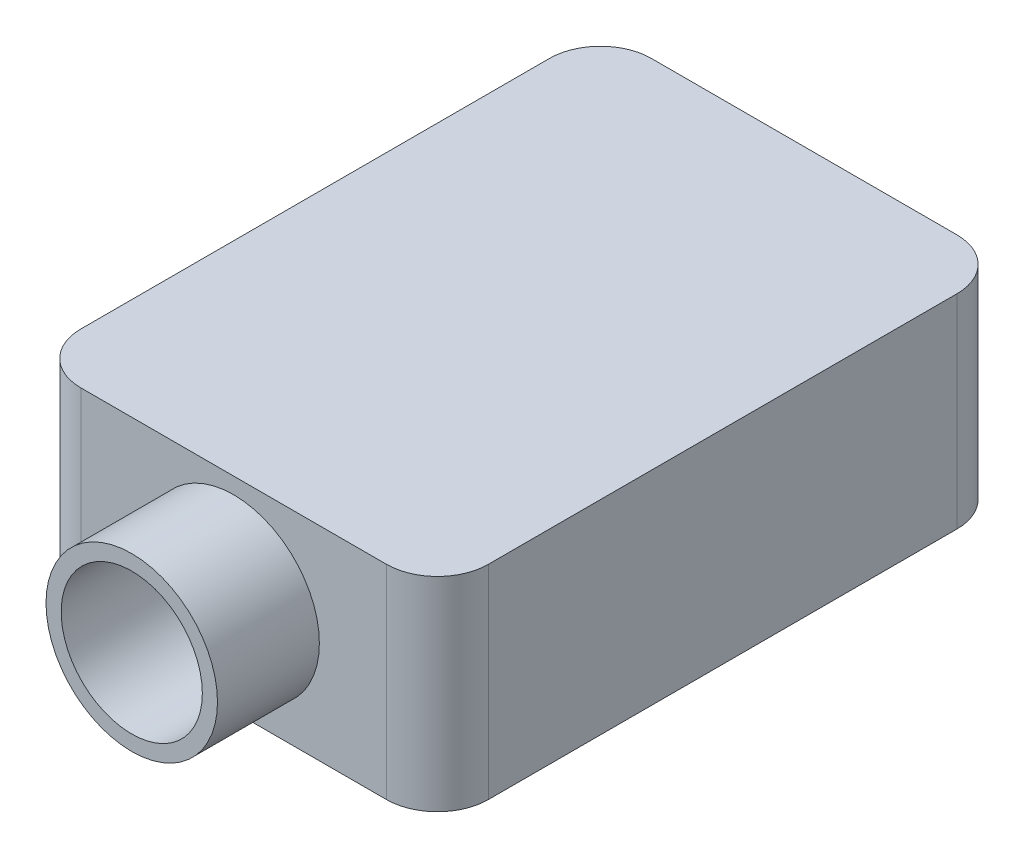
ISO-10303-21;
HEADER;
FILE_DESCRIPTION(('STEP AP214'),'2;1');
FILE_NAME('part.step','',(''),(''),'','','');
FILE_SCHEMA(('AUTOMOTIVE_DESIGN { 1 0 10303 214 1 1 1 1 }'));
ENDSEC;
DATA;
#1=APPLICATION_CONTEXT('core data for automotive mechanical design processes');
#2=APPLICATION_PROTOCOL_DEFINITION('international standard','automotive_design',2000,#1);
#3=PRODUCT_CONTEXT('',#1,'mechanical');
#4=PRODUCT('Part','Part','',(#3));
#5=PRODUCT_RELATED_PRODUCT_CATEGORY('part','',(#4));
#6=PRODUCT_DEFINITION_FORMATION('','',#4);
#7=PRODUCT_DEFINITION_CONTEXT('part definition',#1,'design');
#8=PRODUCT_DEFINITION('design','',#6,#7);
#9=PRODUCT_DEFINITION_SHAPE('','',#8);
#10=(LENGTH_UNIT() NAMED_UNIT(*) SI_UNIT(.MILLI.,.METRE.));
#11=(NAMED_UNIT(*) PLANE_ANGLE_UNIT() SI_UNIT($,.RADIAN.));
#12=(NAMED_UNIT(*) SI_UNIT($,.STERADIAN.) SOLID_ANGLE_UNIT());
#13=UNCERTAINTY_MEASURE_WITH_UNIT(LENGTH_MEASURE(1.E-05),#10,'distance_accuracy_value','');
#14=(GEOMETRIC_REPRESENTATION_CONTEXT(3) GLOBAL_UNCERTAINTY_ASSIGNED_CONTEXT((#13)) GLOBAL_UNIT_ASSIGNED_CONTEXT((#10,
#11,#12)) REPRESENTATION_CONTEXT('',''));
#15=CARTESIAN_POINT('',(0.,0.,0.));
#16=DIRECTION('',(0.,0.,1.));
#17=DIRECTION('',(1.,0.,0.));
#18=AXIS2_PLACEMENT_3D('',#15,#16,#17);
#19=CARTESIAN_POINT('',(20.,20.,28.));
#20=DIRECTION('',(-1.,0.,0.));
#21=DIRECTION('',(0.,0.,1.));
#22=AXIS2_PLACEMENT_3D('',#19,#20,#21);
#23=PLANE('',#22);
#24=DIRECTION('',(0.,0.,-1.));
#25=VECTOR('',#24,1.);
#26=CARTESIAN_POINT('',(20.,0.,28.));
#27=LINE('',#26,#25);
#28=CARTESIAN_POINT('',(20.,0.,23.));
#29=VERTEX_POINT('',#28);
#30=CARTESIAN_POINT('',(20.,0.,-23.));
#31=VERTEX_POINT('',#30);
#32=EDGE_CURVE('E130',#29,#31,#27,.T.);
#33=ORIENTED_EDGE('',*,*,#32,.T.);
#34=DIRECTION('',(0.,-1.,0.));
#35=VECTOR('',#34,1.);
#36=CARTESIAN_POINT('',(20.,20.,-23.));
#37=LINE('',#36,#35);
#38=CARTESIAN_POINT('',(20.,20.,-23.));
#39=VERTEX_POINT('',#38);
#40=EDGE_CURVE('E11',#31,#39,#37,.F.);
#41=ORIENTED_EDGE('',*,*,#40,.T.);
#42=DIRECTION('',(0.,0.,-1.));
#43=VECTOR('',#42,1.);
#44=CARTESIAN_POINT('',(20.,20.,28.));
#45=LINE('',#44,#43);
#46=CARTESIAN_POINT('',(20.,20.,23.));
#47=VERTEX_POINT('',#46);
#48=EDGE_CURVE('E128',#47,#39,#45,.T.);
#49=ORIENTED_EDGE('',*,*,#48,.F.);
#50=DIRECTION('',(0.,-1.,0.));
#51=VECTOR('',#50,1.);
#52=CARTESIAN_POINT('',(20.,20.,23.));
#53=LINE('',#52,#51);
#54=EDGE_CURVE('E42',#47,#29,#53,.T.);
#55=ORIENTED_EDGE('',*,*,#54,.T.);
#56=EDGE_LOOP('',(#33,#41,#49,#55));
#57=FACE_BOUND('',#56,.T.);
#58=ADVANCED_FACE('F34',(#57),#23,.F.);
#59=CARTESIAN_POINT('',(-20.,20.,-28.));
#60=DIRECTION('',(0.,0.,1.));
#61=DIRECTION('',(1.,0.,0.));
#62=AXIS2_PLACEMENT_3D('',#59,#60,#61);
#63=PLANE('',#62);
#64=DIRECTION('',(-1.,0.,0.));
#65=VECTOR('',#64,1.);
#66=CARTESIAN_POINT('',(-20.,0.,-28.));
#67=LINE('',#66,#65);
#68=CARTESIAN_POINT('',(15.,0.,-28.));
#69=VERTEX_POINT('',#68);
#70=CARTESIAN_POINT('',(-15.,0.,-28.));
#71=VERTEX_POINT('',#70);
#72=EDGE_CURVE('E126',#69,#71,#67,.T.);
#73=ORIENTED_EDGE('',*,*,#72,.T.);
#74=DIRECTION('',(0.,-1.,0.));
#75=VECTOR('',#74,1.);
#76=CARTESIAN_POINT('',(-15.,20.,-28.));
#77=LINE('',#76,#75);
#78=CARTESIAN_POINT('',(-15.,20.,-28.));
#79=VERTEX_POINT('',#78);
#80=EDGE_CURVE('E105',#71,#79,#77,.F.);
#81=ORIENTED_EDGE('',*,*,#80,.T.);
#82=DIRECTION('',(-1.,0.,0.));
#83=VECTOR('',#82,1.);
#84=CARTESIAN_POINT('',(-20.,20.,-28.));
#85=LINE('',#84,#83);
#86=CARTESIAN_POINT('',(15.,20.,-28.));
#87=VERTEX_POINT('',#86);
#88=EDGE_CURVE('E173',#87,#79,#85,.T.);
#89=ORIENTED_EDGE('',*,*,#88,.F.);
#90=DIRECTION('',(0.,-1.,0.));
#91=VECTOR('',#90,1.);
#92=CARTESIAN_POINT('',(15.,20.,-28.));
#93=LINE('',#92,#91);
#94=EDGE_CURVE('E110',#87,#69,#93,.T.);
#95=ORIENTED_EDGE('',*,*,#94,.T.);
#96=EDGE_LOOP('',(#73,#81,#89,#95));
#97=FACE_BOUND('',#96,.T.);
#98=ADVANCED_FACE('F201',(#97),#63,.F.);
#99=CARTESIAN_POINT('',(-20.,20.,28.));
#100=DIRECTION('',(1.,0.,0.));
#101=DIRECTION('',(0.,0.,-1.));
#102=AXIS2_PLACEMENT_3D('',#99,#100,#101);
#103=PLANE('',#102);
#104=DIRECTION('',(0.,0.,1.));
#105=VECTOR('',#104,1.);
#106=CARTESIAN_POINT('',(-20.,20.,28.));
#107=LINE('',#106,#105);
#108=CARTESIAN_POINT('',(-20.,20.,-23.));
#109=VERTEX_POINT('',#108);
#110=CARTESIAN_POINT('',(-20.,20.,23.));
#111=VERTEX_POINT('',#110);
#112=EDGE_CURVE('E119',#109,#111,#107,.T.);
#113=ORIENTED_EDGE('',*,*,#112,.F.);
#114=DIRECTION('',(0.,-1.,0.));
#115=VECTOR('',#114,1.);
#116=CARTESIAN_POINT('',(-20.,20.,-23.));
#117=LINE('',#116,#115);
#118=CARTESIAN_POINT('',(-20.,0.,-23.));
#119=VERTEX_POINT('',#118);
#120=EDGE_CURVE('E104',#109,#119,#117,.T.);
#121=ORIENTED_EDGE('',*,*,#120,.T.);
#122=DIRECTION('',(0.,0.,1.));
#123=VECTOR('',#122,1.);
#124=CARTESIAN_POINT('',(-20.,0.,28.));
#125=LINE('',#124,#123);
#126=CARTESIAN_POINT('',(-20.,0.,23.));
#127=VERTEX_POINT('',#126);
#128=EDGE_CURVE('E117',#119,#127,#125,.T.);
#129=ORIENTED_EDGE('',*,*,#128,.T.);
#130=DIRECTION('',(0.,-1.,0.));
#131=VECTOR('',#130,1.);
#132=CARTESIAN_POINT('',(-20.,20.,23.));
#133=LINE('',#132,#131);
#134=EDGE_CURVE('E121',#127,#111,#133,.F.);
#135=ORIENTED_EDGE('',*,*,#134,.T.);
#136=EDGE_LOOP('',(#113,#121,#129,#135));
#137=FACE_BOUND('',#136,.T.);
#138=ADVANCED_FACE('F116',(#137),#103,.F.);
#139=CARTESIAN_POINT('',(-20.,20.,28.));
#140=DIRECTION('',(0.,0.,-1.));
#141=DIRECTION('',(-1.,0.,0.));
#142=AXIS2_PLACEMENT_3D('',#139,#140,#141);
#143=PLANE('',#142);
#144=CARTESIAN_POINT('',(0.,10.,28.));
#145=DIRECTION('',(0.,0.,-1.));
#146=DIRECTION('',(-1.,0.,0.));
#147=AXIS2_PLACEMENT_3D('',#144,#145,#146);
#148=CIRCLE('',#147,8.41555302950392);
#149=CARTESIAN_POINT('',(-8.41555302950392,10.,28.));
#150=VERTEX_POINT('',#149);
#151=EDGE_CURVE('E134',#150,#150,#148,.F.);
#152=ORIENTED_EDGE('',*,*,#151,.F.);
#153=EDGE_LOOP('',(#152));
#154=FACE_BOUND('',#153,.T.);
#155=DIRECTION('',(1.,0.,0.));
#156=VECTOR('',#155,1.);
#157=CARTESIAN_POINT('',(-20.,20.,28.));
#158=LINE('',#157,#156);
#159=CARTESIAN_POINT('',(-15.,20.,28.));
#160=VERTEX_POINT('',#159);
#161=CARTESIAN_POINT('',(15.,20.,28.));
#162=VERTEX_POINT('',#161);
#163=EDGE_CURVE('E137',#160,#162,#158,.T.);
#164=ORIENTED_EDGE('',*,*,#163,.F.);
#165=DIRECTION('',(0.,-1.,0.));
#166=VECTOR('',#165,1.);
#167=CARTESIAN_POINT('',(-15.,20.,28.));
#168=LINE('',#167,#166);
#169=CARTESIAN_POINT('',(-15.,0.,28.));
#170=VERTEX_POINT('',#169);
#171=EDGE_CURVE('E154',#160,#170,#168,.T.);
#172=ORIENTED_EDGE('',*,*,#171,.T.);
#173=DIRECTION('',(1.,0.,0.));
#174=VECTOR('',#173,1.);
#175=CARTESIAN_POINT('',(-20.,0.,28.));
#176=LINE('',#175,#174);
#177=CARTESIAN_POINT('',(15.,0.,28.));
#178=VERTEX_POINT('',#177);
#179=EDGE_CURVE('E125',#170,#178,#176,.T.);
#180=ORIENTED_EDGE('',*,*,#179,.T.);
#181=DIRECTION('',(0.,-1.,0.));
#182=VECTOR('',#181,1.);
#183=CARTESIAN_POINT('',(15.,20.,28.));
#184=LINE('',#183,#182);
#185=EDGE_CURVE('E49',#178,#162,#184,.F.);
#186=ORIENTED_EDGE('',*,*,#185,.T.);
#187=EDGE_LOOP('',(#164,#172,#180,#186));
#188=FACE_BOUND('',#187,.T.);
#189=ADVANCED_FACE('F226',(#154,#188),#143,.F.);
#190=CARTESIAN_POINT('',(0.,20.,0.));
#191=DIRECTION('',(0.,-1.,0.));
#192=DIRECTION('',(0.,0.,-1.));
#193=AXIS2_PLACEMENT_3D('',#190,#191,#192);
#194=PLANE('',#193);
#195=ORIENTED_EDGE('',*,*,#88,.T.);
#196=CARTESIAN_POINT('',(-15.,20.,-23.));
#197=DIRECTION('',(0.,-1.,0.));
#198=DIRECTION('',(0.,0.,-1.));
#199=AXIS2_PLACEMENT_3D('',#196,#197,#198);
#200=CIRCLE('',#199,5.);
#201=EDGE_CURVE('E151',#79,#109,#200,.F.);
#202=ORIENTED_EDGE('',*,*,#201,.T.);
#203=ORIENTED_EDGE('',*,*,#112,.T.);
#204=CARTESIAN_POINT('',(-15.,20.,23.));
#205=DIRECTION('',(0.,-1.,0.));
#206=DIRECTION('',(0.,0.,-1.));
#207=AXIS2_PLACEMENT_3D('',#204,#205,#206);
#208=CIRCLE('',#207,5.);
#209=EDGE_CURVE('E56',#111,#160,#208,.F.);
#210=ORIENTED_EDGE('',*,*,#209,.T.);
#211=ORIENTED_EDGE('',*,*,#163,.T.);
#212=CARTESIAN_POINT('',(15.,20.,23.));
#213=DIRECTION('',(0.,-1.,0.));
#214=DIRECTION('',(0.,0.,-1.));
#215=AXIS2_PLACEMENT_3D('',#212,#213,#214);
#216=CIRCLE('',#215,5.);
#217=EDGE_CURVE('E146',#162,#47,#216,.F.);
#218=ORIENTED_EDGE('',*,*,#217,.T.);
#219=ORIENTED_EDGE('',*,*,#48,.T.);
#220=CARTESIAN_POINT('',(15.,20.,-23.));
#221=DIRECTION('',(0.,-1.,0.));
#222=DIRECTION('',(0.,0.,-1.));
#223=AXIS2_PLACEMENT_3D('',#220,#221,#222);
#224=CIRCLE('',#223,5.);
#225=EDGE_CURVE('E148',#39,#87,#224,.F.);
#226=ORIENTED_EDGE('',*,*,#225,.T.);
#227=EDGE_LOOP('',(#195,#202,#203,#210,#211,#218,#219,#226));
#228=FACE_BOUND('',#227,.T.);
#229=ADVANCED_FACE('F197',(#228),#194,.F.);
#230=CARTESIAN_POINT('',(0.,0.,0.));
#231=DIRECTION('',(0.,-1.,0.));
#232=DIRECTION('',(0.,0.,-1.));
#233=AXIS2_PLACEMENT_3D('',#230,#231,#232);
#234=PLANE('',#233);
#235=ORIENTED_EDGE('',*,*,#128,.F.);
#236=CARTESIAN_POINT('',(-15.,0.,-23.));
#237=DIRECTION('',(0.,-1.,0.));
#238=DIRECTION('',(0.,0.,-1.));
#239=AXIS2_PLACEMENT_3D('',#236,#237,#238);
#240=CIRCLE('',#239,5.);
#241=EDGE_CURVE('E100',#119,#71,#240,.T.);
#242=ORIENTED_EDGE('',*,*,#241,.T.);
#243=ORIENTED_EDGE('',*,*,#72,.F.);
#244=CARTESIAN_POINT('',(15.,0.,-23.));
#245=DIRECTION('',(0.,-1.,0.));
#246=DIRECTION('',(0.,0.,-1.));
#247=AXIS2_PLACEMENT_3D('',#244,#245,#246);
#248=CIRCLE('',#247,5.);
#249=EDGE_CURVE('E140',#69,#31,#248,.T.);
#250=ORIENTED_EDGE('',*,*,#249,.T.);
#251=ORIENTED_EDGE('',*,*,#32,.F.);
#252=CARTESIAN_POINT('',(15.,0.,23.));
#253=DIRECTION('',(0.,-1.,0.));
#254=DIRECTION('',(0.,0.,-1.));
#255=AXIS2_PLACEMENT_3D('',#252,#253,#254);
#256=CIRCLE('',#255,5.);
#257=EDGE_CURVE('E120',#29,#178,#256,.T.);
#258=ORIENTED_EDGE('',*,*,#257,.T.);
#259=ORIENTED_EDGE('',*,*,#179,.F.);
#260=CARTESIAN_POINT('',(-15.,0.,23.));
#261=DIRECTION('',(0.,-1.,0.));
#262=DIRECTION('',(0.,0.,-1.));
#263=AXIS2_PLACEMENT_3D('',#260,#261,#262);
#264=CIRCLE('',#263,5.);
#265=EDGE_CURVE('E111',#170,#127,#264,.T.);
#266=ORIENTED_EDGE('',*,*,#265,.T.);
#267=EDGE_LOOP('',(#235,#242,#243,#250,#251,#258,#259,#266));
#268=FACE_BOUND('',#267,.T.);
#269=ADVANCED_FACE('F123',(#268),#234,.T.);
#270=CARTESIAN_POINT('',(0.,10.,38.));
#271=DIRECTION('',(0.,0.,1.));
#272=DIRECTION('',(1.,0.,0.));
#273=AXIS2_PLACEMENT_3D('',#270,#271,#272);
#274=PLANE('',#273);
#275=CARTESIAN_POINT('',(0.,10.,38.));
#276=DIRECTION('',(0.,0.,1.));
#277=DIRECTION('',(1.,0.,0.));
#278=AXIS2_PLACEMENT_3D('',#275,#276,#277);
#279=CIRCLE('',#278,8.41555302950392);
#280=CARTESIAN_POINT('',(8.41555302950392,10.,38.));
#281=VERTEX_POINT('',#280);
#282=EDGE_CURVE('E166',#281,#281,#279,.T.);
#283=ORIENTED_EDGE('',*,*,#282,.T.);
#284=EDGE_LOOP('',(#283));
#285=FACE_BOUND('',#284,.T.);
#286=CARTESIAN_POINT('',(0.,10.,38.));
#287=DIRECTION('',(0.,0.,1.));
#288=DIRECTION('',(1.,0.,0.));
#289=AXIS2_PLACEMENT_3D('',#286,#287,#288);
#290=CIRCLE('',#289,6.92835699791434);
#291=CARTESIAN_POINT('',(6.92835699791434,10.,38.));
#292=VERTEX_POINT('',#291);
#293=EDGE_CURVE('E168',#292,#292,#290,.T.);
#294=ORIENTED_EDGE('',*,*,#293,.F.);
#295=EDGE_LOOP('',(#294));
#296=FACE_BOUND('',#295,.T.);
#297=ADVANCED_FACE('F186',(#285,#296),#274,.T.);
#298=CARTESIAN_POINT('',(0.,10.,38.));
#299=DIRECTION('',(0.,0.,-1.));
#300=DIRECTION('',(-1.,0.,0.));
#301=AXIS2_PLACEMENT_3D('',#298,#299,#300);
#302=CYLINDRICAL_SURFACE('',#301,8.41555302950392);
#303=ORIENTED_EDGE('',*,*,#282,.F.);
#304=EDGE_LOOP('',(#303));
#305=FACE_BOUND('',#304,.T.);
#306=ORIENTED_EDGE('',*,*,#151,.T.);
#307=EDGE_LOOP('',(#306));
#308=FACE_BOUND('',#307,.T.);
#309=ADVANCED_FACE('F188',(#305,#308),#302,.T.);
#310=CARTESIAN_POINT('',(0.,10.,38.));
#311=DIRECTION('',(0.,0.,-1.));
#312=DIRECTION('',(-1.,0.,0.));
#313=AXIS2_PLACEMENT_3D('',#310,#311,#312);
#314=CYLINDRICAL_SURFACE('',#313,6.92835699791434);
#315=ORIENTED_EDGE('',*,*,#293,.T.);
#316=EDGE_LOOP('',(#315));
#317=FACE_BOUND('',#316,.T.);
#318=CARTESIAN_POINT('',(0.,10.,28.));
#319=DIRECTION('',(0.,0.,1.));
#320=DIRECTION('',(1.,0.,0.));
#321=AXIS2_PLACEMENT_3D('',#318,#319,#320);
#322=CIRCLE('',#321,6.92835699791434);
#323=CARTESIAN_POINT('',(6.92835699791434,10.,28.));
#324=VERTEX_POINT('',#323);
#325=EDGE_CURVE('E177',#324,#324,#322,.T.);
#326=ORIENTED_EDGE('',*,*,#325,.F.);
#327=EDGE_LOOP('',(#326));
#328=FACE_BOUND('',#327,.T.);
#329=ADVANCED_FACE('F183',(#317,#328),#314,.F.);
#330=ORIENTED_EDGE('',*,*,#325,.T.);
#331=EDGE_LOOP('',(#330));
#332=FACE_BOUND('',#331,.T.);
#333=ADVANCED_FACE('F213',(#332),#143,.F.);
#334=CARTESIAN_POINT('',(-15.,20.,-23.));
#335=DIRECTION('',(0.,-1.,0.));
#336=DIRECTION('',(0.,0.,-1.));
#337=AXIS2_PLACEMENT_3D('',#334,#335,#336);
#338=CYLINDRICAL_SURFACE('',#337,5.);
#339=ORIENTED_EDGE('',*,*,#201,.F.);
#340=ORIENTED_EDGE('',*,*,#80,.F.);
#341=ORIENTED_EDGE('',*,*,#241,.F.);
#342=ORIENTED_EDGE('',*,*,#120,.F.);
#343=EDGE_LOOP('',(#339,#340,#341,#342));
#344=FACE_BOUND('',#343,.T.);
#345=ADVANCED_FACE('F103',(#344),#338,.T.);
#346=CARTESIAN_POINT('',(-15.,20.,23.));
#347=DIRECTION('',(0.,-1.,0.));
#348=DIRECTION('',(0.,0.,-1.));
#349=AXIS2_PLACEMENT_3D('',#346,#347,#348);
#350=CYLINDRICAL_SURFACE('',#349,5.);
#351=ORIENTED_EDGE('',*,*,#209,.F.);
#352=ORIENTED_EDGE('',*,*,#134,.F.);
#353=ORIENTED_EDGE('',*,*,#265,.F.);
#354=ORIENTED_EDGE('',*,*,#171,.F.);
#355=EDGE_LOOP('',(#351,#352,#353,#354));
#356=FACE_BOUND('',#355,.T.);
#357=ADVANCED_FACE('F212',(#356),#350,.T.);
#358=CARTESIAN_POINT('',(15.,20.,-23.));
#359=DIRECTION('',(0.,-1.,0.));
#360=DIRECTION('',(0.,0.,-1.));
#361=AXIS2_PLACEMENT_3D('',#358,#359,#360);
#362=CYLINDRICAL_SURFACE('',#361,5.);
#363=ORIENTED_EDGE('',*,*,#225,.F.);
#364=ORIENTED_EDGE('',*,*,#40,.F.);
#365=ORIENTED_EDGE('',*,*,#249,.F.);
#366=ORIENTED_EDGE('',*,*,#94,.F.);
#367=EDGE_LOOP('',(#363,#364,#365,#366));
#368=FACE_BOUND('',#367,.T.);
#369=ADVANCED_FACE('F215',(#368),#362,.T.);
#370=CARTESIAN_POINT('',(15.,20.,23.));
#371=DIRECTION('',(0.,-1.,0.));
#372=DIRECTION('',(0.,0.,-1.));
#373=AXIS2_PLACEMENT_3D('',#370,#371,#372);
#374=CYLINDRICAL_SURFACE('',#373,5.);
#375=ORIENTED_EDGE('',*,*,#217,.F.);
#376=ORIENTED_EDGE('',*,*,#185,.F.);
#377=ORIENTED_EDGE('',*,*,#257,.F.);
#378=ORIENTED_EDGE('',*,*,#54,.F.);
#379=EDGE_LOOP('',(#375,#376,#377,#378));
#380=FACE_BOUND('',#379,.T.);
#381=ADVANCED_FACE('F36',(#380),#374,.T.);
#382=CLOSED_SHELL('',(#58,#98,#138,#189,#229,#269,#297,#309,#329,#333,#345,#357,#369,#381));
#383=MANIFOLD_SOLID_BREP('B2',#382);
#384=ADVANCED_BREP_SHAPE_REPRESENTATION('',(#18,#383),#14);
#385=SHAPE_DEFINITION_REPRESENTATION(#9,#384);
ENDSEC;
END-ISO-10303-21;
